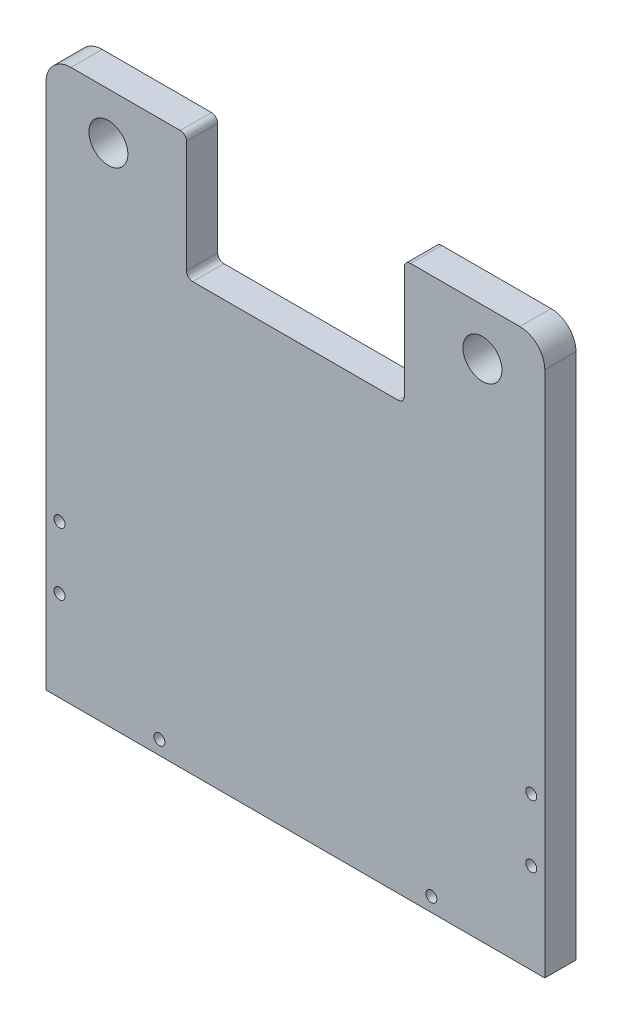
ISO-10303-21;
HEADER;
FILE_DESCRIPTION(('STEP AP214'),'2;1');
FILE_NAME('part.step','',(''),(''),'','','');
FILE_SCHEMA(('AUTOMOTIVE_DESIGN { 1 0 10303 214 1 1 1 1 }'));
ENDSEC;
DATA;
#1=APPLICATION_CONTEXT('core data for automotive mechanical design processes');
#2=APPLICATION_PROTOCOL_DEFINITION('international standard','automotive_design',2000,#1);
#3=PRODUCT_CONTEXT('',#1,'mechanical');
#4=PRODUCT('Part','Part','',(#3));
#5=PRODUCT_RELATED_PRODUCT_CATEGORY('part','',(#4));
#6=PRODUCT_DEFINITION_FORMATION('','',#4);
#7=PRODUCT_DEFINITION_CONTEXT('part definition',#1,'design');
#8=PRODUCT_DEFINITION('design','',#6,#7);
#9=PRODUCT_DEFINITION_SHAPE('','',#8);
#10=(LENGTH_UNIT() NAMED_UNIT(*) SI_UNIT(.MILLI.,.METRE.));
#11=(NAMED_UNIT(*) PLANE_ANGLE_UNIT() SI_UNIT($,.RADIAN.));
#12=(NAMED_UNIT(*) SI_UNIT($,.STERADIAN.) SOLID_ANGLE_UNIT());
#13=UNCERTAINTY_MEASURE_WITH_UNIT(LENGTH_MEASURE(1.E-05),#10,'distance_accuracy_value','');
#14=(GEOMETRIC_REPRESENTATION_CONTEXT(3) GLOBAL_UNCERTAINTY_ASSIGNED_CONTEXT((#13)) GLOBAL_UNIT_ASSIGNED_CONTEXT((#10,
#11,#12)) REPRESENTATION_CONTEXT('',''));
#15=CARTESIAN_POINT('',(0.,0.,0.));
#16=DIRECTION('',(0.,0.,1.));
#17=DIRECTION('',(1.,0.,0.));
#18=AXIS2_PLACEMENT_3D('',#15,#16,#17);
#19=CARTESIAN_POINT('',(0.,137.,10.));
#20=DIRECTION('',(0.,1.,0.));
#21=DIRECTION('',(0.,0.,1.));
#22=AXIS2_PLACEMENT_3D('',#19,#20,#21);
#23=PLANE('',#22);
#24=DIRECTION('',(1.,0.,0.));
#25=VECTOR('',#24,1.);
#26=CARTESIAN_POINT('',(0.,137.,0.));
#27=LINE('',#26,#25);
#28=CARTESIAN_POINT('',(47.0625489045683,137.,0.));
#29=VERTEX_POINT('',#28);
#30=CARTESIAN_POINT('',(112.937451095432,137.,0.));
#31=VERTEX_POINT('',#30);
#32=EDGE_CURVE('E197',#29,#31,#27,.T.);
#33=ORIENTED_EDGE('',*,*,#32,.F.);
#34=DIRECTION('',(0.,0.,-1.));
#35=VECTOR('',#34,1.);
#36=CARTESIAN_POINT('',(47.0625489045683,137.,10.));
#37=LINE('',#36,#35);
#38=CARTESIAN_POINT('',(47.0625489045683,137.,10.));
#39=VERTEX_POINT('',#38);
#40=EDGE_CURVE('E11',#39,#29,#37,.T.);
#41=ORIENTED_EDGE('',*,*,#40,.F.);
#42=DIRECTION('',(1.,0.,0.));
#43=VECTOR('',#42,1.);
#44=CARTESIAN_POINT('',(0.,137.,10.));
#45=LINE('',#44,#43);
#46=CARTESIAN_POINT('',(112.937451095432,137.,10.));
#47=VERTEX_POINT('',#46);
#48=EDGE_CURVE('E282',#39,#47,#45,.T.);
#49=ORIENTED_EDGE('',*,*,#48,.T.);
#50=DIRECTION('',(0.,0.,-1.));
#51=VECTOR('',#50,1.);
#52=CARTESIAN_POINT('',(112.937451095432,137.,10.));
#53=LINE('',#52,#51);
#54=EDGE_CURVE('E58',#47,#31,#53,.T.);
#55=ORIENTED_EDGE('',*,*,#54,.T.);
#56=EDGE_LOOP('',(#33,#41,#49,#55));
#57=FACE_BOUND('',#56,.T.);
#58=ADVANCED_FACE('F41',(#57),#23,.T.);
#59=CARTESIAN_POINT('',(47.0625489045683,139.,10.));
#60=DIRECTION('',(0.,0.,-1.));
#61=DIRECTION('',(-1.,0.,0.));
#62=AXIS2_PLACEMENT_3D('',#59,#60,#61);
#63=CYLINDRICAL_SURFACE('',#62,2.);
#64=CARTESIAN_POINT('',(47.0625489045683,139.,0.));
#65=DIRECTION('',(0.,0.,1.));
#66=DIRECTION('',(1.,0.,0.));
#67=AXIS2_PLACEMENT_3D('',#64,#65,#66);
#68=CIRCLE('',#67,2.);
#69=CARTESIAN_POINT('',(45.0625489045683,139.,0.));
#70=VERTEX_POINT('',#69);
#71=EDGE_CURVE('E199',#29,#70,#68,.F.);
#72=ORIENTED_EDGE('',*,*,#71,.T.);
#73=DIRECTION('',(0.,0.,-1.));
#74=VECTOR('',#73,1.);
#75=CARTESIAN_POINT('',(45.0625489045683,139.,10.));
#76=LINE('',#75,#74);
#77=CARTESIAN_POINT('',(45.0625489045683,139.,10.));
#78=VERTEX_POINT('',#77);
#79=EDGE_CURVE('E50',#78,#70,#76,.T.);
#80=ORIENTED_EDGE('',*,*,#79,.F.);
#81=CARTESIAN_POINT('',(47.0625489045683,139.,10.));
#82=DIRECTION('',(0.,0.,1.));
#83=DIRECTION('',(1.,0.,0.));
#84=AXIS2_PLACEMENT_3D('',#81,#82,#83);
#85=CIRCLE('',#84,2.);
#86=EDGE_CURVE('E278',#39,#78,#85,.F.);
#87=ORIENTED_EDGE('',*,*,#86,.F.);
#88=ORIENTED_EDGE('',*,*,#40,.T.);
#89=EDGE_LOOP('',(#72,#80,#87,#88));
#90=FACE_BOUND('',#89,.T.);
#91=ADVANCED_FACE('F266',(#90),#63,.F.);
#92=CARTESIAN_POINT('',(45.0625489045683,0.,10.));
#93=DIRECTION('',(1.,0.,0.));
#94=DIRECTION('',(0.,0.,-1.));
#95=AXIS2_PLACEMENT_3D('',#92,#93,#94);
#96=PLANE('',#95);
#97=DIRECTION('',(0.,-1.,0.));
#98=VECTOR('',#97,1.);
#99=CARTESIAN_POINT('',(45.0625489045683,0.,0.));
#100=LINE('',#99,#98);
#101=CARTESIAN_POINT('',(45.0625489045683,175.,0.));
#102=VERTEX_POINT('',#101);
#103=EDGE_CURVE('E202',#102,#70,#100,.T.);
#104=ORIENTED_EDGE('',*,*,#103,.F.);
#105=DIRECTION('',(0.,0.,-1.));
#106=VECTOR('',#105,1.);
#107=CARTESIAN_POINT('',(45.0625489045683,175.,10.));
#108=LINE('',#107,#106);
#109=CARTESIAN_POINT('',(45.0625489045683,175.,10.));
#110=VERTEX_POINT('',#109);
#111=EDGE_CURVE('E256',#110,#102,#108,.T.);
#112=ORIENTED_EDGE('',*,*,#111,.F.);
#113=DIRECTION('',(0.,-1.,0.));
#114=VECTOR('',#113,1.);
#115=CARTESIAN_POINT('',(45.0625489045683,0.,10.));
#116=LINE('',#115,#114);
#117=EDGE_CURVE('E263',#110,#78,#116,.T.);
#118=ORIENTED_EDGE('',*,*,#117,.T.);
#119=ORIENTED_EDGE('',*,*,#79,.T.);
#120=EDGE_LOOP('',(#104,#112,#118,#119));
#121=FACE_BOUND('',#120,.T.);
#122=ADVANCED_FACE('F261',(#121),#96,.T.);
#123=CARTESIAN_POINT('',(43.0625489045683,175.,10.));
#124=DIRECTION('',(0.,0.,-1.));
#125=DIRECTION('',(-1.,0.,0.));
#126=AXIS2_PLACEMENT_3D('',#123,#124,#125);
#127=CYLINDRICAL_SURFACE('',#126,2.);
#128=CARTESIAN_POINT('',(43.0625489045683,175.,0.));
#129=DIRECTION('',(0.,0.,1.));
#130=DIRECTION('',(1.,0.,0.));
#131=AXIS2_PLACEMENT_3D('',#128,#129,#130);
#132=CIRCLE('',#131,2.);
#133=CARTESIAN_POINT('',(43.0625489045683,177.,0.));
#134=VERTEX_POINT('',#133);
#135=EDGE_CURVE('E205',#134,#102,#132,.F.);
#136=ORIENTED_EDGE('',*,*,#135,.F.);
#137=DIRECTION('',(0.,0.,-1.));
#138=VECTOR('',#137,1.);
#139=CARTESIAN_POINT('',(43.0625489045683,177.,10.));
#140=LINE('',#139,#138);
#141=CARTESIAN_POINT('',(43.0625489045683,177.,10.));
#142=VERTEX_POINT('',#141);
#143=EDGE_CURVE('E254',#142,#134,#140,.T.);
#144=ORIENTED_EDGE('',*,*,#143,.F.);
#145=CARTESIAN_POINT('',(43.0625489045683,175.,10.));
#146=DIRECTION('',(0.,0.,1.));
#147=DIRECTION('',(1.,0.,0.));
#148=AXIS2_PLACEMENT_3D('',#145,#146,#147);
#149=CIRCLE('',#148,2.);
#150=EDGE_CURVE('E275',#142,#110,#149,.F.);
#151=ORIENTED_EDGE('',*,*,#150,.T.);
#152=ORIENTED_EDGE('',*,*,#111,.T.);
#153=EDGE_LOOP('',(#136,#144,#151,#152));
#154=FACE_BOUND('',#153,.T.);
#155=ADVANCED_FACE('F272',(#154),#127,.T.);
#156=CARTESIAN_POINT('',(0.,177.,10.));
#157=DIRECTION('',(0.,1.,0.));
#158=DIRECTION('',(0.,0.,1.));
#159=AXIS2_PLACEMENT_3D('',#156,#157,#158);
#160=PLANE('',#159);
#161=DIRECTION('',(1.,0.,0.));
#162=VECTOR('',#161,1.);
#163=CARTESIAN_POINT('',(0.,177.,0.));
#164=LINE('',#163,#162);
#165=CARTESIAN_POINT('',(8.00000000000006,177.,0.));
#166=VERTEX_POINT('',#165);
#167=EDGE_CURVE('E208',#166,#134,#164,.T.);
#168=ORIENTED_EDGE('',*,*,#167,.F.);
#169=DIRECTION('',(0.,0.,-1.));
#170=VECTOR('',#169,1.);
#171=CARTESIAN_POINT('',(8.00000000000006,177.,10.));
#172=LINE('',#171,#170);
#173=CARTESIAN_POINT('',(8.00000000000006,177.,10.));
#174=VERTEX_POINT('',#173);
#175=EDGE_CURVE('E252',#174,#166,#172,.T.);
#176=ORIENTED_EDGE('',*,*,#175,.F.);
#177=DIRECTION('',(1.,0.,0.));
#178=VECTOR('',#177,1.);
#179=CARTESIAN_POINT('',(0.,177.,10.));
#180=LINE('',#179,#178);
#181=EDGE_CURVE('E280',#174,#142,#180,.T.);
#182=ORIENTED_EDGE('',*,*,#181,.T.);
#183=ORIENTED_EDGE('',*,*,#143,.T.);
#184=EDGE_LOOP('',(#168,#176,#182,#183));
#185=FACE_BOUND('',#184,.T.);
#186=ADVANCED_FACE('F526',(#185),#160,.T.);
#187=CARTESIAN_POINT('',(8.,169.,10.));
#188=DIRECTION('',(0.,0.,-1.));
#189=DIRECTION('',(-1.,0.,0.));
#190=AXIS2_PLACEMENT_3D('',#187,#188,#189);
#191=CYLINDRICAL_SURFACE('',#190,8.);
#192=CARTESIAN_POINT('',(8.,169.,0.));
#193=DIRECTION('',(0.,0.,1.));
#194=DIRECTION('',(1.,0.,0.));
#195=AXIS2_PLACEMENT_3D('',#192,#193,#194);
#196=CIRCLE('',#195,8.);
#197=CARTESIAN_POINT('',(0.,169.,0.));
#198=VERTEX_POINT('',#197);
#199=EDGE_CURVE('E211',#198,#166,#196,.F.);
#200=ORIENTED_EDGE('',*,*,#199,.F.);
#201=DIRECTION('',(0.,0.,-1.));
#202=VECTOR('',#201,1.);
#203=CARTESIAN_POINT('',(0.,169.,10.));
#204=LINE('',#203,#202);
#205=CARTESIAN_POINT('',(0.,169.,10.));
#206=VERTEX_POINT('',#205);
#207=EDGE_CURVE('E250',#206,#198,#204,.T.);
#208=ORIENTED_EDGE('',*,*,#207,.F.);
#209=CARTESIAN_POINT('',(8.,169.,10.));
#210=DIRECTION('',(0.,0.,1.));
#211=DIRECTION('',(1.,0.,0.));
#212=AXIS2_PLACEMENT_3D('',#209,#210,#211);
#213=CIRCLE('',#212,8.);
#214=EDGE_CURVE('E287',#206,#174,#213,.F.);
#215=ORIENTED_EDGE('',*,*,#214,.T.);
#216=ORIENTED_EDGE('',*,*,#175,.T.);
#217=EDGE_LOOP('',(#200,#208,#215,#216));
#218=FACE_BOUND('',#217,.T.);
#219=ADVANCED_FACE('F514',(#218),#191,.T.);
#220=CARTESIAN_POINT('',(0.,0.,10.));
#221=DIRECTION('',(-1.,0.,0.));
#222=DIRECTION('',(0.,0.,1.));
#223=AXIS2_PLACEMENT_3D('',#220,#221,#222);
#224=PLANE('',#223);
#225=DIRECTION('',(0.,1.,0.));
#226=VECTOR('',#225,1.);
#227=CARTESIAN_POINT('',(0.,0.,0.));
#228=LINE('',#227,#226);
#229=CARTESIAN_POINT('',(0.,0.,0.));
#230=VERTEX_POINT('',#229);
#231=EDGE_CURVE('E214',#230,#198,#228,.T.);
#232=ORIENTED_EDGE('',*,*,#231,.F.);
#233=DIRECTION('',(0.,0.,-1.));
#234=VECTOR('',#233,1.);
#235=CARTESIAN_POINT('',(0.,0.,10.));
#236=LINE('',#235,#234);
#237=CARTESIAN_POINT('',(0.,0.,10.));
#238=VERTEX_POINT('',#237);
#239=EDGE_CURVE('E248',#238,#230,#236,.T.);
#240=ORIENTED_EDGE('',*,*,#239,.F.);
#241=DIRECTION('',(0.,1.,0.));
#242=VECTOR('',#241,1.);
#243=CARTESIAN_POINT('',(0.,0.,10.));
#244=LINE('',#243,#242);
#245=EDGE_CURVE('E290',#238,#206,#244,.T.);
#246=ORIENTED_EDGE('',*,*,#245,.T.);
#247=ORIENTED_EDGE('',*,*,#207,.T.);
#248=EDGE_LOOP('',(#232,#240,#246,#247));
#249=FACE_BOUND('',#248,.T.);
#250=ADVANCED_FACE('F503',(#249),#224,.T.);
#251=CARTESIAN_POINT('',(0.,0.,10.));
#252=DIRECTION('',(0.,1.,0.));
#253=DIRECTION('',(0.,0.,1.));
#254=AXIS2_PLACEMENT_3D('',#251,#252,#253);
#255=PLANE('',#254);
#256=DIRECTION('',(1.,0.,0.));
#257=VECTOR('',#256,1.);
#258=CARTESIAN_POINT('',(0.,0.,0.));
#259=LINE('',#258,#257);
#260=CARTESIAN_POINT('',(160.,0.,0.));
#261=VERTEX_POINT('',#260);
#262=EDGE_CURVE('E217',#230,#261,#259,.T.);
#263=ORIENTED_EDGE('',*,*,#262,.T.);
#264=DIRECTION('',(0.,0.,-1.));
#265=VECTOR('',#264,1.);
#266=CARTESIAN_POINT('',(160.,0.,10.));
#267=LINE('',#266,#265);
#268=CARTESIAN_POINT('',(160.,0.,10.));
#269=VERTEX_POINT('',#268);
#270=EDGE_CURVE('E245',#269,#261,#267,.T.);
#271=ORIENTED_EDGE('',*,*,#270,.F.);
#272=DIRECTION('',(1.,0.,0.));
#273=VECTOR('',#272,1.);
#274=CARTESIAN_POINT('',(0.,0.,10.));
#275=LINE('',#274,#273);
#276=EDGE_CURVE('E293',#238,#269,#275,.T.);
#277=ORIENTED_EDGE('',*,*,#276,.F.);
#278=ORIENTED_EDGE('',*,*,#239,.T.);
#279=EDGE_LOOP('',(#263,#271,#277,#278));
#280=FACE_BOUND('',#279,.T.);
#281=ADVANCED_FACE('F492',(#280),#255,.F.);
#282=CARTESIAN_POINT('',(160.,0.,10.));
#283=DIRECTION('',(-1.,0.,0.));
#284=DIRECTION('',(0.,-1.,0.));
#285=AXIS2_PLACEMENT_3D('',#282,#283,#284);
#286=PLANE('',#285);
#287=DIRECTION('',(0.,1.,0.));
#288=VECTOR('',#287,1.);
#289=CARTESIAN_POINT('',(160.,0.,0.));
#290=LINE('',#289,#288);
#291=CARTESIAN_POINT('',(160.,169.,0.));
#292=VERTEX_POINT('',#291);
#293=EDGE_CURVE('E220',#261,#292,#290,.T.);
#294=ORIENTED_EDGE('',*,*,#293,.T.);
#295=DIRECTION('',(0.,0.,-1.));
#296=VECTOR('',#295,1.);
#297=CARTESIAN_POINT('',(160.,169.,10.));
#298=LINE('',#297,#296);
#299=CARTESIAN_POINT('',(160.,169.,10.));
#300=VERTEX_POINT('',#299);
#301=EDGE_CURVE('E242',#300,#292,#298,.T.);
#302=ORIENTED_EDGE('',*,*,#301,.F.);
#303=DIRECTION('',(0.,1.,0.));
#304=VECTOR('',#303,1.);
#305=CARTESIAN_POINT('',(160.,0.,10.));
#306=LINE('',#305,#304);
#307=EDGE_CURVE('E296',#269,#300,#306,.T.);
#308=ORIENTED_EDGE('',*,*,#307,.F.);
#309=ORIENTED_EDGE('',*,*,#270,.T.);
#310=EDGE_LOOP('',(#294,#302,#308,#309));
#311=FACE_BOUND('',#310,.T.);
#312=ADVANCED_FACE('F482',(#311),#286,.F.);
#313=CARTESIAN_POINT('',(152.,169.,10.));
#314=DIRECTION('',(0.,0.,-1.));
#315=DIRECTION('',(-1.,0.,0.));
#316=AXIS2_PLACEMENT_3D('',#313,#314,#315);
#317=CYLINDRICAL_SURFACE('',#316,8.00000000000001);
#318=CARTESIAN_POINT('',(152.,169.,0.));
#319=DIRECTION('',(0.,0.,1.));
#320=DIRECTION('',(1.,0.,0.));
#321=AXIS2_PLACEMENT_3D('',#318,#319,#320);
#322=CIRCLE('',#321,8.00000000000001);
#323=CARTESIAN_POINT('',(152.,177.,0.));
#324=VERTEX_POINT('',#323);
#325=EDGE_CURVE('E223',#292,#324,#322,.T.);
#326=ORIENTED_EDGE('',*,*,#325,.T.);
#327=DIRECTION('',(0.,0.,-1.));
#328=VECTOR('',#327,1.);
#329=CARTESIAN_POINT('',(152.,177.,10.));
#330=LINE('',#329,#328);
#331=CARTESIAN_POINT('',(152.,177.,10.));
#332=VERTEX_POINT('',#331);
#333=EDGE_CURVE('E239',#332,#324,#330,.T.);
#334=ORIENTED_EDGE('',*,*,#333,.F.);
#335=CARTESIAN_POINT('',(152.,169.,10.));
#336=DIRECTION('',(0.,0.,1.));
#337=DIRECTION('',(1.,0.,0.));
#338=AXIS2_PLACEMENT_3D('',#335,#336,#337);
#339=CIRCLE('',#338,8.00000000000001);
#340=EDGE_CURVE('E168',#300,#332,#339,.T.);
#341=ORIENTED_EDGE('',*,*,#340,.F.);
#342=ORIENTED_EDGE('',*,*,#301,.T.);
#343=EDGE_LOOP('',(#326,#334,#341,#342));
#344=FACE_BOUND('',#343,.T.);
#345=ADVANCED_FACE('F301',(#344),#317,.T.);
#346=CARTESIAN_POINT('',(-1.53523027623947E-13,177.,10.));
#347=DIRECTION('',(0.,-1.,0.));
#348=DIRECTION('',(1.,0.,0.));
#349=AXIS2_PLACEMENT_3D('',#346,#347,#348);
#350=PLANE('',#349);
#351=DIRECTION('',(-1.,0.,0.));
#352=VECTOR('',#351,1.);
#353=CARTESIAN_POINT('',(-1.53523027623947E-13,177.,0.));
#354=LINE('',#353,#352);
#355=CARTESIAN_POINT('',(116.937451095432,177.,0.));
#356=VERTEX_POINT('',#355);
#357=EDGE_CURVE('E226',#324,#356,#354,.T.);
#358=ORIENTED_EDGE('',*,*,#357,.T.);
#359=DIRECTION('',(0.,0.,-1.));
#360=VECTOR('',#359,1.);
#361=CARTESIAN_POINT('',(116.937451095432,177.,10.));
#362=LINE('',#361,#360);
#363=CARTESIAN_POINT('',(116.937451095432,177.,10.));
#364=VERTEX_POINT('',#363);
#365=EDGE_CURVE('E154',#364,#356,#362,.T.);
#366=ORIENTED_EDGE('',*,*,#365,.F.);
#367=DIRECTION('',(-1.,0.,0.));
#368=VECTOR('',#367,1.);
#369=CARTESIAN_POINT('',(-1.53523027623947E-13,177.,10.));
#370=LINE('',#369,#368);
#371=EDGE_CURVE('E165',#332,#364,#370,.T.);
#372=ORIENTED_EDGE('',*,*,#371,.F.);
#373=ORIENTED_EDGE('',*,*,#333,.T.);
#374=EDGE_LOOP('',(#358,#366,#372,#373));
#375=FACE_BOUND('',#374,.T.);
#376=ADVANCED_FACE('F303',(#375),#350,.F.);
#377=CARTESIAN_POINT('',(116.937451095432,175.,10.));
#378=DIRECTION('',(0.,0.,-1.));
#379=DIRECTION('',(-1.,0.,0.));
#380=AXIS2_PLACEMENT_3D('',#377,#378,#379);
#381=CYLINDRICAL_SURFACE('',#380,2.);
#382=CARTESIAN_POINT('',(116.937451095432,175.,0.));
#383=DIRECTION('',(0.,0.,1.));
#384=DIRECTION('',(1.,0.,0.));
#385=AXIS2_PLACEMENT_3D('',#382,#383,#384);
#386=CIRCLE('',#385,2.);
#387=CARTESIAN_POINT('',(114.937451095432,175.,0.));
#388=VERTEX_POINT('',#387);
#389=EDGE_CURVE('E151',#388,#356,#386,.F.);
#390=ORIENTED_EDGE('',*,*,#389,.F.);
#391=DIRECTION('',(0.,0.,-1.));
#392=VECTOR('',#391,1.);
#393=CARTESIAN_POINT('',(114.937451095432,175.,10.));
#394=LINE('',#393,#392);
#395=CARTESIAN_POINT('',(114.937451095432,175.,10.));
#396=VERTEX_POINT('',#395);
#397=EDGE_CURVE('E145',#396,#388,#394,.T.);
#398=ORIENTED_EDGE('',*,*,#397,.F.);
#399=CARTESIAN_POINT('',(116.937451095432,175.,10.));
#400=DIRECTION('',(0.,0.,1.));
#401=DIRECTION('',(1.,0.,0.));
#402=AXIS2_PLACEMENT_3D('',#399,#400,#401);
#403=CIRCLE('',#402,2.);
#404=EDGE_CURVE('E149',#396,#364,#403,.F.);
#405=ORIENTED_EDGE('',*,*,#404,.T.);
#406=ORIENTED_EDGE('',*,*,#365,.T.);
#407=EDGE_LOOP('',(#390,#398,#405,#406));
#408=FACE_BOUND('',#407,.T.);
#409=ADVANCED_FACE('F147',(#408),#381,.T.);
#410=CARTESIAN_POINT('',(114.937451095432,0.,10.));
#411=DIRECTION('',(1.,0.,0.));
#412=DIRECTION('',(0.,0.,-1.));
#413=AXIS2_PLACEMENT_3D('',#410,#411,#412);
#414=PLANE('',#413);
#415=DIRECTION('',(0.,-1.,0.));
#416=VECTOR('',#415,1.);
#417=CARTESIAN_POINT('',(114.937451095432,0.,0.));
#418=LINE('',#417,#416);
#419=CARTESIAN_POINT('',(114.937451095432,139.,0.));
#420=VERTEX_POINT('',#419);
#421=EDGE_CURVE('E230',#388,#420,#418,.T.);
#422=ORIENTED_EDGE('',*,*,#421,.T.);
#423=DIRECTION('',(0.,0.,-1.));
#424=VECTOR('',#423,1.);
#425=CARTESIAN_POINT('',(114.937451095432,139.,10.));
#426=LINE('',#425,#424);
#427=CARTESIAN_POINT('',(114.937451095432,139.,10.));
#428=VERTEX_POINT('',#427);
#429=EDGE_CURVE('E102',#428,#420,#426,.T.);
#430=ORIENTED_EDGE('',*,*,#429,.F.);
#431=DIRECTION('',(0.,-1.,0.));
#432=VECTOR('',#431,1.);
#433=CARTESIAN_POINT('',(114.937451095432,0.,10.));
#434=LINE('',#433,#432);
#435=EDGE_CURVE('E156',#396,#428,#434,.T.);
#436=ORIENTED_EDGE('',*,*,#435,.F.);
#437=ORIENTED_EDGE('',*,*,#397,.T.);
#438=EDGE_LOOP('',(#422,#430,#436,#437));
#439=FACE_BOUND('',#438,.T.);
#440=ADVANCED_FACE('F157',(#439),#414,.F.);
#441=CARTESIAN_POINT('',(155.671596304389,28.9999999999999,10.));
#442=DIRECTION('',(0.,0.,-1.));
#443=DIRECTION('',(-1.,0.,0.));
#444=AXIS2_PLACEMENT_3D('',#441,#442,#443);
#445=CYLINDRICAL_SURFACE('',#444,1.74999999999998);
#446=CARTESIAN_POINT('',(155.671596304389,28.9999999999999,10.));
#447=DIRECTION('',(0.,0.,1.));
#448=DIRECTION('',(1.,0.,0.));
#449=AXIS2_PLACEMENT_3D('',#446,#447,#448);
#450=CIRCLE('',#449,1.74999999999998);
#451=CARTESIAN_POINT('',(157.421596304389,28.9999999999999,10.));
#452=VERTEX_POINT('',#451);
#453=EDGE_CURVE('E644',#452,#452,#450,.F.);
#454=ORIENTED_EDGE('',*,*,#453,.F.);
#455=EDGE_LOOP('',(#454));
#456=FACE_BOUND('',#455,.T.);
#457=CARTESIAN_POINT('',(155.671596304389,28.9999999999999,0.));
#458=DIRECTION('',(0.,0.,1.));
#459=DIRECTION('',(1.,0.,0.));
#460=AXIS2_PLACEMENT_3D('',#457,#458,#459);
#461=CIRCLE('',#460,1.74999999999998);
#462=CARTESIAN_POINT('',(157.421596304389,28.9999999999999,0.));
#463=VERTEX_POINT('',#462);
#464=EDGE_CURVE('E194',#463,#463,#461,.F.);
#465=ORIENTED_EDGE('',*,*,#464,.T.);
#466=EDGE_LOOP('',(#465));
#467=FACE_BOUND('',#466,.T.);
#468=ADVANCED_FACE('F325',(#456,#467),#445,.F.);
#469=CARTESIAN_POINT('',(140.,162.,10.));
#470=DIRECTION('',(0.,0.,-1.));
#471=DIRECTION('',(-1.,0.,0.));
#472=AXIS2_PLACEMENT_3D('',#469,#470,#471);
#473=CYLINDRICAL_SURFACE('',#472,6.25);
#474=CARTESIAN_POINT('',(140.,162.,10.));
#475=DIRECTION('',(0.,0.,1.));
#476=DIRECTION('',(1.,0.,0.));
#477=AXIS2_PLACEMENT_3D('',#474,#475,#476);
#478=CIRCLE('',#477,6.25);
#479=CARTESIAN_POINT('',(146.25,162.,10.));
#480=VERTEX_POINT('',#479);
#481=EDGE_CURVE('E641',#480,#480,#478,.F.);
#482=ORIENTED_EDGE('',*,*,#481,.F.);
#483=EDGE_LOOP('',(#482));
#484=FACE_BOUND('',#483,.T.);
#485=CARTESIAN_POINT('',(140.,162.,0.));
#486=DIRECTION('',(0.,0.,1.));
#487=DIRECTION('',(1.,0.,0.));
#488=AXIS2_PLACEMENT_3D('',#485,#486,#487);
#489=CIRCLE('',#488,6.25);
#490=CARTESIAN_POINT('',(146.25,162.,0.));
#491=VERTEX_POINT('',#490);
#492=EDGE_CURVE('E191',#491,#491,#489,.F.);
#493=ORIENTED_EDGE('',*,*,#492,.T.);
#494=EDGE_LOOP('',(#493));
#495=FACE_BOUND('',#494,.T.);
#496=ADVANCED_FACE('F328',(#484,#495),#473,.F.);
#497=CARTESIAN_POINT('',(20.,162.,10.));
#498=DIRECTION('',(0.,0.,-1.));
#499=DIRECTION('',(-1.,0.,0.));
#500=AXIS2_PLACEMENT_3D('',#497,#498,#499);
#501=CYLINDRICAL_SURFACE('',#500,6.25);
#502=CARTESIAN_POINT('',(20.,162.,10.));
#503=DIRECTION('',(0.,0.,1.));
#504=DIRECTION('',(1.,0.,0.));
#505=AXIS2_PLACEMENT_3D('',#502,#503,#504);
#506=CIRCLE('',#505,6.25);
#507=CARTESIAN_POINT('',(26.25,162.,10.));
#508=VERTEX_POINT('',#507);
#509=EDGE_CURVE('E638',#508,#508,#506,.T.);
#510=ORIENTED_EDGE('',*,*,#509,.T.);
#511=EDGE_LOOP('',(#510));
#512=FACE_BOUND('',#511,.T.);
#513=CARTESIAN_POINT('',(20.,162.,0.));
#514=DIRECTION('',(0.,0.,1.));
#515=DIRECTION('',(1.,0.,0.));
#516=AXIS2_PLACEMENT_3D('',#513,#514,#515);
#517=CIRCLE('',#516,6.25);
#518=CARTESIAN_POINT('',(26.25,162.,0.));
#519=VERTEX_POINT('',#518);
#520=EDGE_CURVE('E188',#519,#519,#517,.T.);
#521=ORIENTED_EDGE('',*,*,#520,.F.);
#522=EDGE_LOOP('',(#521));
#523=FACE_BOUND('',#522,.T.);
#524=ADVANCED_FACE('F332',(#512,#523),#501,.F.);
#525=CARTESIAN_POINT('',(4.32840369561144,48.9999999999999,10.));
#526=DIRECTION('',(0.,0.,-1.));
#527=DIRECTION('',(-1.,0.,0.));
#528=AXIS2_PLACEMENT_3D('',#525,#526,#527);
#529=CYLINDRICAL_SURFACE('',#528,1.74999999999997);
#530=CARTESIAN_POINT('',(4.32840369561144,48.9999999999999,10.));
#531=DIRECTION('',(0.,0.,1.));
#532=DIRECTION('',(1.,0.,0.));
#533=AXIS2_PLACEMENT_3D('',#530,#531,#532);
#534=CIRCLE('',#533,1.74999999999997);
#535=CARTESIAN_POINT('',(6.07840369561141,48.9999999999999,10.));
#536=VERTEX_POINT('',#535);
#537=EDGE_CURVE('E635',#536,#536,#534,.T.);
#538=ORIENTED_EDGE('',*,*,#537,.T.);
#539=EDGE_LOOP('',(#538));
#540=FACE_BOUND('',#539,.T.);
#541=CARTESIAN_POINT('',(4.32840369561144,48.9999999999999,0.));
#542=DIRECTION('',(0.,0.,1.));
#543=DIRECTION('',(1.,0.,0.));
#544=AXIS2_PLACEMENT_3D('',#541,#542,#543);
#545=CIRCLE('',#544,1.74999999999997);
#546=CARTESIAN_POINT('',(6.07840369561141,48.9999999999999,0.));
#547=VERTEX_POINT('',#546);
#548=EDGE_CURVE('E185',#547,#547,#545,.T.);
#549=ORIENTED_EDGE('',*,*,#548,.F.);
#550=EDGE_LOOP('',(#549));
#551=FACE_BOUND('',#550,.T.);
#552=ADVANCED_FACE('F336',(#540,#551),#529,.F.);
#553=CARTESIAN_POINT('',(4.32840369561144,28.9999999999999,10.));
#554=DIRECTION('',(0.,0.,-1.));
#555=DIRECTION('',(-1.,0.,0.));
#556=AXIS2_PLACEMENT_3D('',#553,#554,#555);
#557=CYLINDRICAL_SURFACE('',#556,1.75);
#558=CARTESIAN_POINT('',(4.32840369561144,28.9999999999999,10.));
#559=DIRECTION('',(0.,0.,1.));
#560=DIRECTION('',(1.,0.,0.));
#561=AXIS2_PLACEMENT_3D('',#558,#559,#560);
#562=CIRCLE('',#561,1.75);
#563=CARTESIAN_POINT('',(6.07840369561144,28.9999999999999,10.));
#564=VERTEX_POINT('',#563);
#565=EDGE_CURVE('E628',#564,#564,#562,.T.);
#566=ORIENTED_EDGE('',*,*,#565,.T.);
#567=EDGE_LOOP('',(#566));
#568=FACE_BOUND('',#567,.T.);
#569=CARTESIAN_POINT('',(4.32840369561144,28.9999999999999,0.));
#570=DIRECTION('',(0.,0.,1.));
#571=DIRECTION('',(1.,0.,0.));
#572=AXIS2_PLACEMENT_3D('',#569,#570,#571);
#573=CIRCLE('',#572,1.75);
#574=CARTESIAN_POINT('',(6.07840369561144,28.9999999999999,0.));
#575=VERTEX_POINT('',#574);
#576=EDGE_CURVE('E182',#575,#575,#573,.T.);
#577=ORIENTED_EDGE('',*,*,#576,.F.);
#578=EDGE_LOOP('',(#577));
#579=FACE_BOUND('',#578,.T.);
#580=ADVANCED_FACE('F340',(#568,#579),#557,.F.);
#581=CARTESIAN_POINT('',(36.3713027717086,4.49999999999996,10.));
#582=DIRECTION('',(0.,0.,-1.));
#583=DIRECTION('',(-1.,0.,0.));
#584=AXIS2_PLACEMENT_3D('',#581,#582,#583);
#585=CYLINDRICAL_SURFACE('',#584,1.75);
#586=CARTESIAN_POINT('',(36.3713027717086,4.49999999999996,10.));
#587=DIRECTION('',(0.,0.,1.));
#588=DIRECTION('',(1.,0.,0.));
#589=AXIS2_PLACEMENT_3D('',#586,#587,#588);
#590=CIRCLE('',#589,1.75);
#591=CARTESIAN_POINT('',(38.1213027717086,4.49999999999996,10.));
#592=VERTEX_POINT('',#591);
#593=EDGE_CURVE('E625',#592,#592,#590,.T.);
#594=ORIENTED_EDGE('',*,*,#593,.T.);
#595=EDGE_LOOP('',(#594));
#596=FACE_BOUND('',#595,.T.);
#597=CARTESIAN_POINT('',(36.3713027717086,4.49999999999996,0.));
#598=DIRECTION('',(0.,0.,1.));
#599=DIRECTION('',(1.,0.,0.));
#600=AXIS2_PLACEMENT_3D('',#597,#598,#599);
#601=CIRCLE('',#600,1.75);
#602=CARTESIAN_POINT('',(38.1213027717086,4.49999999999996,0.));
#603=VERTEX_POINT('',#602);
#604=EDGE_CURVE('E179',#603,#603,#601,.T.);
#605=ORIENTED_EDGE('',*,*,#604,.F.);
#606=EDGE_LOOP('',(#605));
#607=FACE_BOUND('',#606,.T.);
#608=ADVANCED_FACE('F344',(#596,#607),#585,.F.);
#609=CARTESIAN_POINT('',(123.628697228291,4.49999999999996,10.));
#610=DIRECTION('',(0.,0.,-1.));
#611=DIRECTION('',(-1.,0.,0.));
#612=AXIS2_PLACEMENT_3D('',#609,#610,#611);
#613=CYLINDRICAL_SURFACE('',#612,1.75000000000001);
#614=CARTESIAN_POINT('',(123.628697228291,4.49999999999996,10.));
#615=DIRECTION('',(0.,0.,1.));
#616=DIRECTION('',(1.,0.,0.));
#617=AXIS2_PLACEMENT_3D('',#614,#615,#616);
#618=CIRCLE('',#617,1.75000000000001);
#619=CARTESIAN_POINT('',(125.378697228291,4.49999999999996,10.));
#620=VERTEX_POINT('',#619);
#621=EDGE_CURVE('E355',#620,#620,#618,.F.);
#622=ORIENTED_EDGE('',*,*,#621,.F.);
#623=EDGE_LOOP('',(#622));
#624=FACE_BOUND('',#623,.T.);
#625=CARTESIAN_POINT('',(123.628697228291,4.49999999999996,0.));
#626=DIRECTION('',(0.,0.,1.));
#627=DIRECTION('',(1.,0.,0.));
#628=AXIS2_PLACEMENT_3D('',#625,#626,#627);
#629=CIRCLE('',#628,1.75000000000001);
#630=CARTESIAN_POINT('',(125.378697228291,4.49999999999996,0.));
#631=VERTEX_POINT('',#630);
#632=EDGE_CURVE('E176',#631,#631,#629,.F.);
#633=ORIENTED_EDGE('',*,*,#632,.T.);
#634=EDGE_LOOP('',(#633));
#635=FACE_BOUND('',#634,.T.);
#636=ADVANCED_FACE('F313',(#624,#635),#613,.F.);
#637=CARTESIAN_POINT('',(155.671596304389,48.9999999999999,10.));
#638=DIRECTION('',(0.,0.,-1.));
#639=DIRECTION('',(-1.,0.,0.));
#640=AXIS2_PLACEMENT_3D('',#637,#638,#639);
#641=CYLINDRICAL_SURFACE('',#640,1.74999999999996);
#642=CARTESIAN_POINT('',(155.671596304389,48.9999999999999,10.));
#643=DIRECTION('',(0.,0.,1.));
#644=DIRECTION('',(1.,0.,0.));
#645=AXIS2_PLACEMENT_3D('',#642,#643,#644);
#646=CIRCLE('',#645,1.74999999999996);
#647=CARTESIAN_POINT('',(157.421596304388,48.9999999999999,10.));
#648=VERTEX_POINT('',#647);
#649=EDGE_CURVE('E235',#648,#648,#646,.F.);
#650=ORIENTED_EDGE('',*,*,#649,.F.);
#651=EDGE_LOOP('',(#650));
#652=FACE_BOUND('',#651,.T.);
#653=CARTESIAN_POINT('',(155.671596304389,48.9999999999999,0.));
#654=DIRECTION('',(0.,0.,1.));
#655=DIRECTION('',(1.,0.,0.));
#656=AXIS2_PLACEMENT_3D('',#653,#654,#655);
#657=CIRCLE('',#656,1.74999999999996);
#658=CARTESIAN_POINT('',(157.421596304388,48.9999999999999,0.));
#659=VERTEX_POINT('',#658);
#660=EDGE_CURVE('E173',#659,#659,#657,.F.);
#661=ORIENTED_EDGE('',*,*,#660,.T.);
#662=EDGE_LOOP('',(#661));
#663=FACE_BOUND('',#662,.T.);
#664=ADVANCED_FACE('F43',(#652,#663),#641,.F.);
#665=CARTESIAN_POINT('',(112.937451095432,139.,10.));
#666=DIRECTION('',(0.,0.,-1.));
#667=DIRECTION('',(-1.,0.,0.));
#668=AXIS2_PLACEMENT_3D('',#665,#666,#667);
#669=CYLINDRICAL_SURFACE('',#668,2.);
#670=CARTESIAN_POINT('',(112.937451095432,139.,0.));
#671=DIRECTION('',(0.,0.,1.));
#672=DIRECTION('',(1.,0.,0.));
#673=AXIS2_PLACEMENT_3D('',#670,#671,#672);
#674=CIRCLE('',#673,2.);
#675=EDGE_CURVE('E232',#31,#420,#674,.T.);
#676=ORIENTED_EDGE('',*,*,#675,.F.);
#677=ORIENTED_EDGE('',*,*,#54,.F.);
#678=CARTESIAN_POINT('',(112.937451095432,139.,10.));
#679=DIRECTION('',(0.,0.,1.));
#680=DIRECTION('',(1.,0.,0.));
#681=AXIS2_PLACEMENT_3D('',#678,#679,#680);
#682=CIRCLE('',#681,2.);
#683=EDGE_CURVE('E160',#47,#428,#682,.T.);
#684=ORIENTED_EDGE('',*,*,#683,.T.);
#685=ORIENTED_EDGE('',*,*,#429,.T.);
#686=EDGE_LOOP('',(#676,#677,#684,#685));
#687=FACE_BOUND('',#686,.T.);
#688=ADVANCED_FACE('F304',(#687),#669,.F.);
#689=CARTESIAN_POINT('',(0.,0.,10.));
#690=DIRECTION('',(0.,0.,1.));
#691=DIRECTION('',(1.,0.,0.));
#692=AXIS2_PLACEMENT_3D('',#689,#690,#691);
#693=PLANE('',#692);
#694=ORIENTED_EDGE('',*,*,#649,.T.);
#695=EDGE_LOOP('',(#694));
#696=FACE_BOUND('',#695,.T.);
#697=ORIENTED_EDGE('',*,*,#621,.T.);
#698=EDGE_LOOP('',(#697));
#699=FACE_BOUND('',#698,.T.);
#700=ORIENTED_EDGE('',*,*,#593,.F.);
#701=EDGE_LOOP('',(#700));
#702=FACE_BOUND('',#701,.T.);
#703=ORIENTED_EDGE('',*,*,#565,.F.);
#704=EDGE_LOOP('',(#703));
#705=FACE_BOUND('',#704,.T.);
#706=ORIENTED_EDGE('',*,*,#537,.F.);
#707=EDGE_LOOP('',(#706));
#708=FACE_BOUND('',#707,.T.);
#709=ORIENTED_EDGE('',*,*,#509,.F.);
#710=EDGE_LOOP('',(#709));
#711=FACE_BOUND('',#710,.T.);
#712=ORIENTED_EDGE('',*,*,#481,.T.);
#713=EDGE_LOOP('',(#712));
#714=FACE_BOUND('',#713,.T.);
#715=ORIENTED_EDGE('',*,*,#453,.T.);
#716=EDGE_LOOP('',(#715));
#717=FACE_BOUND('',#716,.T.);
#718=ORIENTED_EDGE('',*,*,#48,.F.);
#719=ORIENTED_EDGE('',*,*,#86,.T.);
#720=ORIENTED_EDGE('',*,*,#117,.F.);
#721=ORIENTED_EDGE('',*,*,#150,.F.);
#722=ORIENTED_EDGE('',*,*,#181,.F.);
#723=ORIENTED_EDGE('',*,*,#214,.F.);
#724=ORIENTED_EDGE('',*,*,#245,.F.);
#725=ORIENTED_EDGE('',*,*,#276,.T.);
#726=ORIENTED_EDGE('',*,*,#307,.T.);
#727=ORIENTED_EDGE('',*,*,#340,.T.);
#728=ORIENTED_EDGE('',*,*,#371,.T.);
#729=ORIENTED_EDGE('',*,*,#404,.F.);
#730=ORIENTED_EDGE('',*,*,#435,.T.);
#731=ORIENTED_EDGE('',*,*,#683,.F.);
#732=EDGE_LOOP('',(#718,#719,#720,#721,#722,#723,#724,#725,#726,#727,#728,#729,#730,#731));
#733=FACE_BOUND('',#732,.T.);
#734=ADVANCED_FACE('F163',(#696,#699,#702,#705,#708,#711,#714,#717,#733),#693,.T.);
#735=CARTESIAN_POINT('',(0.,0.,0.));
#736=DIRECTION('',(0.,0.,1.));
#737=DIRECTION('',(1.,0.,0.));
#738=AXIS2_PLACEMENT_3D('',#735,#736,#737);
#739=PLANE('',#738);
#740=ORIENTED_EDGE('',*,*,#660,.F.);
#741=EDGE_LOOP('',(#740));
#742=FACE_BOUND('',#741,.T.);
#743=ORIENTED_EDGE('',*,*,#632,.F.);
#744=EDGE_LOOP('',(#743));
#745=FACE_BOUND('',#744,.T.);
#746=ORIENTED_EDGE('',*,*,#604,.T.);
#747=EDGE_LOOP('',(#746));
#748=FACE_BOUND('',#747,.T.);
#749=ORIENTED_EDGE('',*,*,#576,.T.);
#750=EDGE_LOOP('',(#749));
#751=FACE_BOUND('',#750,.T.);
#752=ORIENTED_EDGE('',*,*,#548,.T.);
#753=EDGE_LOOP('',(#752));
#754=FACE_BOUND('',#753,.T.);
#755=ORIENTED_EDGE('',*,*,#520,.T.);
#756=EDGE_LOOP('',(#755));
#757=FACE_BOUND('',#756,.T.);
#758=ORIENTED_EDGE('',*,*,#492,.F.);
#759=EDGE_LOOP('',(#758));
#760=FACE_BOUND('',#759,.T.);
#761=ORIENTED_EDGE('',*,*,#464,.F.);
#762=EDGE_LOOP('',(#761));
#763=FACE_BOUND('',#762,.T.);
#764=ORIENTED_EDGE('',*,*,#32,.T.);
#765=ORIENTED_EDGE('',*,*,#675,.T.);
#766=ORIENTED_EDGE('',*,*,#421,.F.);
#767=ORIENTED_EDGE('',*,*,#389,.T.);
#768=ORIENTED_EDGE('',*,*,#357,.F.);
#769=ORIENTED_EDGE('',*,*,#325,.F.);
#770=ORIENTED_EDGE('',*,*,#293,.F.);
#771=ORIENTED_EDGE('',*,*,#262,.F.);
#772=ORIENTED_EDGE('',*,*,#231,.T.);
#773=ORIENTED_EDGE('',*,*,#199,.T.);
#774=ORIENTED_EDGE('',*,*,#167,.T.);
#775=ORIENTED_EDGE('',*,*,#135,.T.);
#776=ORIENTED_EDGE('',*,*,#103,.T.);
#777=ORIENTED_EDGE('',*,*,#71,.F.);
#778=EDGE_LOOP('',(#764,#765,#766,#767,#768,#769,#770,#771,#772,#773,#774,#775,#776,#777));
#779=FACE_BOUND('',#778,.T.);
#780=ADVANCED_FACE('F268',(#742,#745,#748,#751,#754,#757,#760,#763,#779),#739,.F.);
#781=CLOSED_SHELL('',(#58,#91,#122,#155,#186,#219,#250,#281,#312,#345,#376,#409,#440,#468,#496,
#524,#552,#580,#608,#636,#664,#688,#734,#780));
#782=MANIFOLD_SOLID_BREP('B2',#781);
#783=ADVANCED_BREP_SHAPE_REPRESENTATION('',(#18,#782),#14);
#784=SHAPE_DEFINITION_REPRESENTATION(#9,#783);
ENDSEC;
END-ISO-10303-21;
